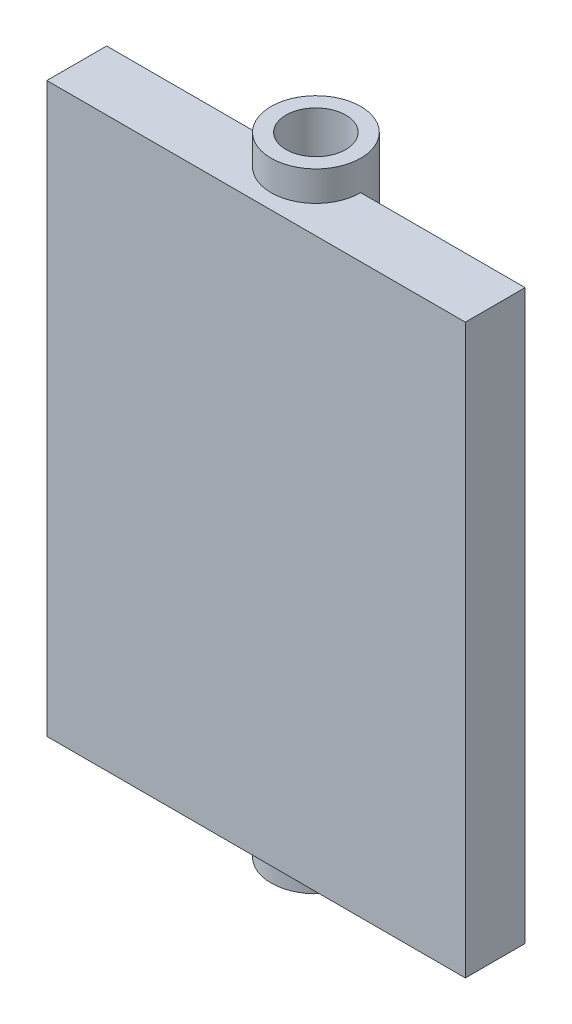
ISO-10303-21;
HEADER;
FILE_DESCRIPTION(('STEP AP214'),'2;1');
FILE_NAME('part.step','',(''),(''),'','','');
FILE_SCHEMA(('AUTOMOTIVE_DESIGN { 1 0 10303 214 1 1 1 1 }'));
ENDSEC;
DATA;
#1=APPLICATION_CONTEXT('core data for automotive mechanical design processes');
#2=APPLICATION_PROTOCOL_DEFINITION('international standard','automotive_design',2000,#1);
#3=PRODUCT_CONTEXT('',#1,'mechanical');
#4=PRODUCT('Part','Part','',(#3));
#5=PRODUCT_RELATED_PRODUCT_CATEGORY('part','',(#4));
#6=PRODUCT_DEFINITION_FORMATION('','',#4);
#7=PRODUCT_DEFINITION_CONTEXT('part definition',#1,'design');
#8=PRODUCT_DEFINITION('design','',#6,#7);
#9=PRODUCT_DEFINITION_SHAPE('','',#8);
#10=(LENGTH_UNIT() NAMED_UNIT(*) SI_UNIT(.MILLI.,.METRE.));
#11=(NAMED_UNIT(*) PLANE_ANGLE_UNIT() SI_UNIT($,.RADIAN.));
#12=(NAMED_UNIT(*) SI_UNIT($,.STERADIAN.) SOLID_ANGLE_UNIT());
#13=UNCERTAINTY_MEASURE_WITH_UNIT(LENGTH_MEASURE(1.E-05),#10,'distance_accuracy_value','');
#14=(GEOMETRIC_REPRESENTATION_CONTEXT(3) GLOBAL_UNCERTAINTY_ASSIGNED_CONTEXT((#13)) GLOBAL_UNIT_ASSIGNED_CONTEXT((#10,
#11,#12)) REPRESENTATION_CONTEXT('',''));
#15=CARTESIAN_POINT('',(0.,0.,0.));
#16=DIRECTION('',(0.,0.,1.));
#17=DIRECTION('',(1.,0.,0.));
#18=AXIS2_PLACEMENT_3D('',#15,#16,#17);
#19=CARTESIAN_POINT('',(0.,66.675,0.));
#20=DIRECTION('',(0.,1.,0.));
#21=DIRECTION('',(0.,0.,1.));
#22=AXIS2_PLACEMENT_3D('',#19,#20,#21);
#23=PLANE('',#22);
#24=CARTESIAN_POINT('',(0.,66.675,0.));
#25=DIRECTION('',(0.,1.,0.));
#26=DIRECTION('',(0.,0.,1.));
#27=AXIS2_PLACEMENT_3D('',#24,#25,#26);
#28=CIRCLE('',#27,9.525);
#29=CARTESIAN_POINT('',(0.,66.675,9.525));
#30=VERTEX_POINT('',#29);
#31=EDGE_CURVE('E11',#30,#30,#28,.T.);
#32=ORIENTED_EDGE('',*,*,#31,.T.);
#33=EDGE_LOOP('',(#32));
#34=FACE_BOUND('',#33,.T.);
#35=CARTESIAN_POINT('',(0.,66.675,0.));
#36=DIRECTION('',(0.,1.,0.));
#37=DIRECTION('',(0.,0.,1.));
#38=AXIS2_PLACEMENT_3D('',#35,#36,#37);
#39=CIRCLE('',#38,6.35);
#40=CARTESIAN_POINT('',(0.,66.675,6.35));
#41=VERTEX_POINT('',#40);
#42=EDGE_CURVE('E124',#41,#41,#39,.T.);
#43=ORIENTED_EDGE('',*,*,#42,.F.);
#44=EDGE_LOOP('',(#43));
#45=FACE_BOUND('',#44,.T.);
#46=ADVANCED_FACE('F39',(#34,#45),#23,.T.);
#47=CARTESIAN_POINT('',(0.,-66.675,0.));
#48=DIRECTION('',(0.,1.,0.));
#49=DIRECTION('',(0.,0.,1.));
#50=AXIS2_PLACEMENT_3D('',#47,#48,#49);
#51=PLANE('',#50);
#52=CARTESIAN_POINT('',(0.,-66.675,0.));
#53=DIRECTION('',(0.,1.,0.));
#54=DIRECTION('',(0.,0.,1.));
#55=AXIS2_PLACEMENT_3D('',#52,#53,#54);
#56=CIRCLE('',#55,9.525);
#57=CARTESIAN_POINT('',(0.,-66.675,9.525));
#58=VERTEX_POINT('',#57);
#59=EDGE_CURVE('E43',#58,#58,#56,.T.);
#60=ORIENTED_EDGE('',*,*,#59,.F.);
#61=EDGE_LOOP('',(#60));
#62=FACE_BOUND('',#61,.T.);
#63=CARTESIAN_POINT('',(0.,-66.675,0.));
#64=DIRECTION('',(0.,1.,0.));
#65=DIRECTION('',(0.,0.,1.));
#66=AXIS2_PLACEMENT_3D('',#63,#64,#65);
#67=CIRCLE('',#66,6.35);
#68=CARTESIAN_POINT('',(0.,-66.675,6.35));
#69=VERTEX_POINT('',#68);
#70=EDGE_CURVE('E119',#69,#69,#67,.T.);
#71=ORIENTED_EDGE('',*,*,#70,.T.);
#72=EDGE_LOOP('',(#71));
#73=FACE_BOUND('',#72,.T.);
#74=ADVANCED_FACE('F139',(#62,#73),#51,.F.);
#75=CARTESIAN_POINT('',(0.,66.675,0.));
#76=DIRECTION('',(0.,-1.,0.));
#77=DIRECTION('',(0.,0.,-1.));
#78=AXIS2_PLACEMENT_3D('',#75,#76,#77);
#79=CYLINDRICAL_SURFACE('',#78,9.525);
#80=DIRECTION('',(0.,-1.,0.));
#81=VECTOR('',#80,1.);
#82=CARTESIAN_POINT('',(-9.525,60.325,0.));
#83=LINE('',#82,#81);
#84=CARTESIAN_POINT('',(-9.525,60.325,0.));
#85=VERTEX_POINT('',#84);
#86=CARTESIAN_POINT('',(-9.525,-60.325,0.));
#87=VERTEX_POINT('',#86);
#88=EDGE_CURVE('E60',#85,#87,#83,.T.);
#89=ORIENTED_EDGE('',*,*,#88,.F.);
#90=CARTESIAN_POINT('',(0.,60.325,0.));
#91=DIRECTION('',(0.,-1.,0.));
#92=DIRECTION('',(0.,0.,1.));
#93=AXIS2_PLACEMENT_3D('',#90,#91,#92);
#94=CIRCLE('',#93,9.525);
#95=CARTESIAN_POINT('',(9.525,60.325,0.));
#96=VERTEX_POINT('',#95);
#97=EDGE_CURVE('E55',#96,#85,#94,.T.);
#98=ORIENTED_EDGE('',*,*,#97,.F.);
#99=DIRECTION('',(0.,-1.,0.));
#100=VECTOR('',#99,1.);
#101=CARTESIAN_POINT('',(9.525,60.325,0.));
#102=LINE('',#101,#100);
#103=CARTESIAN_POINT('',(9.525,-60.325,0.));
#104=VERTEX_POINT('',#103);
#105=EDGE_CURVE('E264',#96,#104,#102,.T.);
#106=ORIENTED_EDGE('',*,*,#105,.T.);
#107=CARTESIAN_POINT('',(0.,-60.325,0.));
#108=DIRECTION('',(0.,-1.,0.));
#109=DIRECTION('',(0.,0.,1.));
#110=AXIS2_PLACEMENT_3D('',#107,#108,#109);
#111=CIRCLE('',#110,9.525);
#112=EDGE_CURVE('E254',#104,#87,#111,.T.);
#113=ORIENTED_EDGE('',*,*,#112,.T.);
#114=EDGE_LOOP('',(#89,#98,#106,#113));
#115=FACE_BOUND('',#114,.T.);
#116=ORIENTED_EDGE('',*,*,#31,.F.);
#117=EDGE_LOOP('',(#116));
#118=FACE_BOUND('',#117,.T.);
#119=ORIENTED_EDGE('',*,*,#59,.T.);
#120=EDGE_LOOP('',(#119));
#121=FACE_BOUND('',#120,.T.);
#122=ADVANCED_FACE('F41',(#115,#118,#121),#79,.T.);
#123=CARTESIAN_POINT('',(0.,66.675,0.));
#124=DIRECTION('',(0.,-1.,0.));
#125=DIRECTION('',(0.,0.,-1.));
#126=AXIS2_PLACEMENT_3D('',#123,#124,#125);
#127=CYLINDRICAL_SURFACE('',#126,6.35);
#128=ORIENTED_EDGE('',*,*,#42,.T.);
#129=EDGE_LOOP('',(#128));
#130=FACE_BOUND('',#129,.T.);
#131=ORIENTED_EDGE('',*,*,#70,.F.);
#132=EDGE_LOOP('',(#131));
#133=FACE_BOUND('',#132,.T.);
#134=ADVANCED_FACE('F144',(#130,#133),#127,.F.);
#135=CARTESIAN_POINT('',(-44.45,60.325,0.));
#136=DIRECTION('',(1.,0.,0.));
#137=DIRECTION('',(0.,0.,-1.));
#138=AXIS2_PLACEMENT_3D('',#135,#136,#137);
#139=PLANE('',#138);
#140=DIRECTION('',(0.,0.,1.));
#141=VECTOR('',#140,1.);
#142=CARTESIAN_POINT('',(-44.45,-60.325,0.));
#143=LINE('',#142,#141);
#144=CARTESIAN_POINT('',(-44.45,-60.325,0.));
#145=VERTEX_POINT('',#144);
#146=CARTESIAN_POINT('',(-44.45,-60.325,12.7));
#147=VERTEX_POINT('',#146);
#148=EDGE_CURVE('E117',#145,#147,#143,.T.);
#149=ORIENTED_EDGE('',*,*,#148,.T.);
#150=DIRECTION('',(0.,-1.,0.));
#151=VECTOR('',#150,1.);
#152=CARTESIAN_POINT('',(-44.45,60.325,12.7));
#153=LINE('',#152,#151);
#154=CARTESIAN_POINT('',(-44.45,60.325,12.7));
#155=VERTEX_POINT('',#154);
#156=EDGE_CURVE('E95',#155,#147,#153,.T.);
#157=ORIENTED_EDGE('',*,*,#156,.F.);
#158=DIRECTION('',(0.,0.,1.));
#159=VECTOR('',#158,1.);
#160=CARTESIAN_POINT('',(-44.45,60.325,0.));
#161=LINE('',#160,#159);
#162=CARTESIAN_POINT('',(-44.45,60.325,0.));
#163=VERTEX_POINT('',#162);
#164=EDGE_CURVE('E103',#163,#155,#161,.T.);
#165=ORIENTED_EDGE('',*,*,#164,.F.);
#166=DIRECTION('',(0.,-1.,0.));
#167=VECTOR('',#166,1.);
#168=CARTESIAN_POINT('',(-44.45,60.325,0.));
#169=LINE('',#168,#167);
#170=EDGE_CURVE('E259',#163,#145,#169,.T.);
#171=ORIENTED_EDGE('',*,*,#170,.T.);
#172=EDGE_LOOP('',(#149,#157,#165,#171));
#173=FACE_BOUND('',#172,.T.);
#174=ADVANCED_FACE('F115',(#173),#139,.F.);
#175=CARTESIAN_POINT('',(-44.45,60.325,12.7));
#176=DIRECTION('',(0.,0.,-1.));
#177=DIRECTION('',(-1.,0.,0.));
#178=AXIS2_PLACEMENT_3D('',#175,#176,#177);
#179=PLANE('',#178);
#180=DIRECTION('',(1.,0.,0.));
#181=VECTOR('',#180,1.);
#182=CARTESIAN_POINT('',(-44.45,-60.325,12.7));
#183=LINE('',#182,#181);
#184=CARTESIAN_POINT('',(44.45,-60.325,12.7));
#185=VERTEX_POINT('',#184);
#186=EDGE_CURVE('E239',#147,#185,#183,.T.);
#187=ORIENTED_EDGE('',*,*,#186,.T.);
#188=DIRECTION('',(0.,-1.,0.));
#189=VECTOR('',#188,1.);
#190=CARTESIAN_POINT('',(44.45,60.325,12.7));
#191=LINE('',#190,#189);
#192=CARTESIAN_POINT('',(44.45,60.325,12.7));
#193=VERTEX_POINT('',#192);
#194=EDGE_CURVE('E98',#193,#185,#191,.T.);
#195=ORIENTED_EDGE('',*,*,#194,.F.);
#196=DIRECTION('',(1.,0.,0.));
#197=VECTOR('',#196,1.);
#198=CARTESIAN_POINT('',(-44.45,60.325,12.7));
#199=LINE('',#198,#197);
#200=EDGE_CURVE('E91',#155,#193,#199,.T.);
#201=ORIENTED_EDGE('',*,*,#200,.F.);
#202=ORIENTED_EDGE('',*,*,#156,.T.);
#203=EDGE_LOOP('',(#187,#195,#201,#202));
#204=FACE_BOUND('',#203,.T.);
#205=ADVANCED_FACE('F93',(#204),#179,.F.);
#206=CARTESIAN_POINT('',(44.45,60.325,0.));
#207=DIRECTION('',(-1.,0.,0.));
#208=DIRECTION('',(0.,0.,1.));
#209=AXIS2_PLACEMENT_3D('',#206,#207,#208);
#210=PLANE('',#209);
#211=DIRECTION('',(0.,0.,-1.));
#212=VECTOR('',#211,1.);
#213=CARTESIAN_POINT('',(44.45,-60.325,0.));
#214=LINE('',#213,#212);
#215=CARTESIAN_POINT('',(44.45,-60.325,0.));
#216=VERTEX_POINT('',#215);
#217=EDGE_CURVE('E243',#185,#216,#214,.T.);
#218=ORIENTED_EDGE('',*,*,#217,.T.);
#219=DIRECTION('',(0.,-1.,0.));
#220=VECTOR('',#219,1.);
#221=CARTESIAN_POINT('',(44.45,60.325,0.));
#222=LINE('',#221,#220);
#223=CARTESIAN_POINT('',(44.45,60.325,0.));
#224=VERTEX_POINT('',#223);
#225=EDGE_CURVE('E126',#224,#216,#222,.T.);
#226=ORIENTED_EDGE('',*,*,#225,.F.);
#227=DIRECTION('',(0.,0.,-1.));
#228=VECTOR('',#227,1.);
#229=CARTESIAN_POINT('',(44.45,60.325,0.));
#230=LINE('',#229,#228);
#231=EDGE_CURVE('E102',#193,#224,#230,.T.);
#232=ORIENTED_EDGE('',*,*,#231,.F.);
#233=ORIENTED_EDGE('',*,*,#194,.T.);
#234=EDGE_LOOP('',(#218,#226,#232,#233));
#235=FACE_BOUND('',#234,.T.);
#236=ADVANCED_FACE('F185',(#235),#210,.F.);
#237=CARTESIAN_POINT('',(9.525,60.325,0.));
#238=DIRECTION('',(0.,0.,1.));
#239=DIRECTION('',(1.,0.,0.));
#240=AXIS2_PLACEMENT_3D('',#237,#238,#239);
#241=PLANE('',#240);
#242=DIRECTION('',(-1.,0.,0.));
#243=VECTOR('',#242,1.);
#244=CARTESIAN_POINT('',(9.525,-60.325,0.));
#245=LINE('',#244,#243);
#246=EDGE_CURVE('E250',#216,#104,#245,.T.);
#247=ORIENTED_EDGE('',*,*,#246,.T.);
#248=ORIENTED_EDGE('',*,*,#105,.F.);
#249=DIRECTION('',(-1.,0.,0.));
#250=VECTOR('',#249,1.);
#251=CARTESIAN_POINT('',(9.525,60.325,0.));
#252=LINE('',#251,#250);
#253=EDGE_CURVE('E272',#224,#96,#252,.T.);
#254=ORIENTED_EDGE('',*,*,#253,.F.);
#255=ORIENTED_EDGE('',*,*,#225,.T.);
#256=EDGE_LOOP('',(#247,#248,#254,#255));
#257=FACE_BOUND('',#256,.T.);
#258=ADVANCED_FACE('F194',(#257),#241,.F.);
#259=CARTESIAN_POINT('',(-44.45,60.325,0.));
#260=DIRECTION('',(0.,0.,1.));
#261=DIRECTION('',(1.,0.,0.));
#262=AXIS2_PLACEMENT_3D('',#259,#260,#261);
#263=PLANE('',#262);
#264=DIRECTION('',(-1.,0.,0.));
#265=VECTOR('',#264,1.);
#266=CARTESIAN_POINT('',(-44.45,-60.325,0.));
#267=LINE('',#266,#265);
#268=EDGE_CURVE('E113',#87,#145,#267,.T.);
#269=ORIENTED_EDGE('',*,*,#268,.T.);
#270=ORIENTED_EDGE('',*,*,#170,.F.);
#271=DIRECTION('',(-1.,0.,0.));
#272=VECTOR('',#271,1.);
#273=CARTESIAN_POINT('',(-44.45,60.325,0.));
#274=LINE('',#273,#272);
#275=EDGE_CURVE('E108',#85,#163,#274,.T.);
#276=ORIENTED_EDGE('',*,*,#275,.F.);
#277=ORIENTED_EDGE('',*,*,#88,.T.);
#278=EDGE_LOOP('',(#269,#270,#276,#277));
#279=FACE_BOUND('',#278,.T.);
#280=ADVANCED_FACE('F204',(#279),#263,.F.);
#281=CARTESIAN_POINT('',(0.,60.325,0.));
#282=DIRECTION('',(0.,1.,0.));
#283=DIRECTION('',(0.,0.,1.));
#284=AXIS2_PLACEMENT_3D('',#281,#282,#283);
#285=PLANE('',#284);
#286=ORIENTED_EDGE('',*,*,#164,.T.);
#287=ORIENTED_EDGE('',*,*,#200,.T.);
#288=ORIENTED_EDGE('',*,*,#231,.T.);
#289=ORIENTED_EDGE('',*,*,#253,.T.);
#290=ORIENTED_EDGE('',*,*,#97,.T.);
#291=ORIENTED_EDGE('',*,*,#275,.T.);
#292=EDGE_LOOP('',(#286,#287,#288,#289,#290,#291));
#293=FACE_BOUND('',#292,.T.);
#294=ADVANCED_FACE('F106',(#293),#285,.T.);
#295=CARTESIAN_POINT('',(0.,-60.325,0.));
#296=DIRECTION('',(0.,1.,0.));
#297=DIRECTION('',(0.,0.,1.));
#298=AXIS2_PLACEMENT_3D('',#295,#296,#297);
#299=PLANE('',#298);
#300=ORIENTED_EDGE('',*,*,#148,.F.);
#301=ORIENTED_EDGE('',*,*,#268,.F.);
#302=ORIENTED_EDGE('',*,*,#112,.F.);
#303=ORIENTED_EDGE('',*,*,#246,.F.);
#304=ORIENTED_EDGE('',*,*,#217,.F.);
#305=ORIENTED_EDGE('',*,*,#186,.F.);
#306=EDGE_LOOP('',(#300,#301,#302,#303,#304,#305));
#307=FACE_BOUND('',#306,.T.);
#308=ADVANCED_FACE('F223',(#307),#299,.F.);
#309=CLOSED_SHELL('',(#46,#74,#122,#134,#174,#205,#236,#258,#280,#294,#308));
#310=MANIFOLD_SOLID_BREP('B2',#309);
#311=ADVANCED_BREP_SHAPE_REPRESENTATION('',(#18,#310),#14);
#312=SHAPE_DEFINITION_REPRESENTATION(#9,#311);
ENDSEC;
END-ISO-10303-21;
